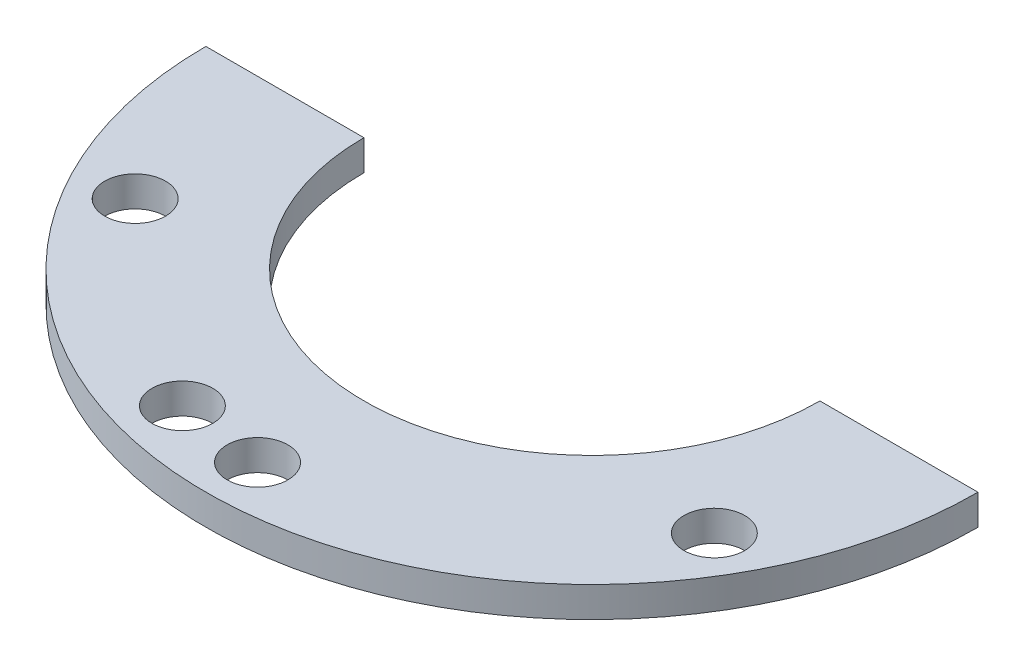
ISO-10303-21;
HEADER;
FILE_DESCRIPTION(('STEP AP214'),'2;1');
FILE_NAME('part.step','',(''),(''),'','','');
FILE_SCHEMA(('AUTOMOTIVE_DESIGN { 1 0 10303 214 1 1 1 1 }'));
ENDSEC;
DATA;
#1=APPLICATION_CONTEXT('core data for automotive mechanical design processes');
#2=APPLICATION_PROTOCOL_DEFINITION('international standard','automotive_design',2000,#1);
#3=PRODUCT_CONTEXT('',#1,'mechanical');
#4=PRODUCT('Part','Part','',(#3));
#5=PRODUCT_RELATED_PRODUCT_CATEGORY('part','',(#4));
#6=PRODUCT_DEFINITION_FORMATION('','',#4);
#7=PRODUCT_DEFINITION_CONTEXT('part definition',#1,'design');
#8=PRODUCT_DEFINITION('design','',#6,#7);
#9=PRODUCT_DEFINITION_SHAPE('','',#8);
#10=(LENGTH_UNIT() NAMED_UNIT(*) SI_UNIT(.MILLI.,.METRE.));
#11=(NAMED_UNIT(*) PLANE_ANGLE_UNIT() SI_UNIT($,.RADIAN.));
#12=(NAMED_UNIT(*) SI_UNIT($,.STERADIAN.) SOLID_ANGLE_UNIT());
#13=UNCERTAINTY_MEASURE_WITH_UNIT(LENGTH_MEASURE(1.E-05),#10,'distance_accuracy_value','');
#14=(GEOMETRIC_REPRESENTATION_CONTEXT(3) GLOBAL_UNCERTAINTY_ASSIGNED_CONTEXT((#13)) GLOBAL_UNIT_ASSIGNED_CONTEXT((#10,
#11,#12)) REPRESENTATION_CONTEXT('',''));
#15=CARTESIAN_POINT('',(0.,0.,0.));
#16=DIRECTION('',(0.,0.,1.));
#17=DIRECTION('',(1.,0.,0.));
#18=AXIS2_PLACEMENT_3D('',#15,#16,#17);
#19=CARTESIAN_POINT('',(0.,1.,0.));
#20=DIRECTION('',(0.,-1.,0.));
#21=DIRECTION('',(0.,0.,-1.));
#22=AXIS2_PLACEMENT_3D('',#19,#20,#21);
#23=CYLINDRICAL_SURFACE('',#22,12.7);
#24=CARTESIAN_POINT('',(0.,1.,0.));
#25=DIRECTION('',(0.,1.,0.));
#26=DIRECTION('',(0.,0.,1.));
#27=AXIS2_PLACEMENT_3D('',#24,#25,#26);
#28=CIRCLE('',#27,12.7);
#29=CARTESIAN_POINT('',(-12.7,1.,0.));
#30=VERTEX_POINT('',#29);
#31=CARTESIAN_POINT('',(12.7,1.,0.));
#32=VERTEX_POINT('',#31);
#33=EDGE_CURVE('E76',#30,#32,#28,.T.);
#34=ORIENTED_EDGE('',*,*,#33,.F.);
#35=DIRECTION('',(0.,-1.,0.));
#36=VECTOR('',#35,1.);
#37=CARTESIAN_POINT('',(-12.7,1.,0.));
#38=LINE('',#37,#36);
#39=CARTESIAN_POINT('',(-12.7,0.,0.));
#40=VERTEX_POINT('',#39);
#41=EDGE_CURVE('E119',#30,#40,#38,.T.);
#42=ORIENTED_EDGE('',*,*,#41,.T.);
#43=CARTESIAN_POINT('',(0.,0.,0.));
#44=DIRECTION('',(0.,1.,0.));
#45=DIRECTION('',(0.,0.,1.));
#46=AXIS2_PLACEMENT_3D('',#43,#44,#45);
#47=CIRCLE('',#46,12.7);
#48=CARTESIAN_POINT('',(12.7,0.,0.));
#49=VERTEX_POINT('',#48);
#50=EDGE_CURVE('E84',#40,#49,#47,.T.);
#51=ORIENTED_EDGE('',*,*,#50,.T.);
#52=DIRECTION('',(0.,-1.,0.));
#53=VECTOR('',#52,1.);
#54=CARTESIAN_POINT('',(12.7,1.,0.));
#55=LINE('',#54,#53);
#56=EDGE_CURVE('E89',#49,#32,#55,.F.);
#57=ORIENTED_EDGE('',*,*,#56,.T.);
#58=EDGE_LOOP('',(#34,#42,#51,#57));
#59=FACE_BOUND('',#58,.T.);
#60=ADVANCED_FACE('F32',(#59),#23,.T.);
#61=CARTESIAN_POINT('',(0.,1.,0.));
#62=DIRECTION('',(0.,1.,0.));
#63=DIRECTION('',(0.,0.,1.));
#64=AXIS2_PLACEMENT_3D('',#61,#62,#63);
#65=PLANE('',#64);
#66=CARTESIAN_POINT('',(-2.84700949612715,1.,10.6251840891799));
#67=DIRECTION('',(0.,1.,0.));
#68=DIRECTION('',(0.,0.,1.));
#69=AXIS2_PLACEMENT_3D('',#66,#67,#68);
#70=CIRCLE('',#69,1.00000000000027);
#71=CARTESIAN_POINT('',(-2.84700949612715,1.,11.6251840891802));
#72=VERTEX_POINT('',#71);
#73=EDGE_CURVE('E85',#72,#72,#70,.T.);
#74=ORIENTED_EDGE('',*,*,#73,.F.);
#75=EDGE_LOOP('',(#74));
#76=FACE_BOUND('',#75,.T.);
#77=DIRECTION('',(1.,0.,0.));
#78=VECTOR('',#77,1.);
#79=CARTESIAN_POINT('',(0.,1.,0.));
#80=LINE('',#79,#78);
#81=CARTESIAN_POINT('',(-7.5,1.,0.));
#82=VERTEX_POINT('',#81);
#83=EDGE_CURVE('E53',#30,#82,#80,.T.);
#84=ORIENTED_EDGE('',*,*,#83,.F.);
#85=ORIENTED_EDGE('',*,*,#33,.T.);
#86=CARTESIAN_POINT('',(7.5,1.,0.));
#87=VERTEX_POINT('',#86);
#88=EDGE_CURVE('E94',#87,#32,#80,.T.);
#89=ORIENTED_EDGE('',*,*,#88,.F.);
#90=CARTESIAN_POINT('',(0.,1.,0.));
#91=DIRECTION('',(0.,1.,0.));
#92=DIRECTION('',(0.,0.,1.));
#93=AXIS2_PLACEMENT_3D('',#90,#91,#92);
#94=CIRCLE('',#93,7.5);
#95=EDGE_CURVE('E88',#82,#87,#94,.T.);
#96=ORIENTED_EDGE('',*,*,#95,.F.);
#97=EDGE_LOOP('',(#84,#85,#89,#96));
#98=FACE_BOUND('',#97,.T.);
#99=CARTESIAN_POINT('',(-9.52627944162812,1.,5.50000000000041));
#100=DIRECTION('',(0.,1.,0.));
#101=DIRECTION('',(0.,0.,1.));
#102=AXIS2_PLACEMENT_3D('',#99,#100,#101);
#103=CIRCLE('',#102,0.999999999999829);
#104=CARTESIAN_POINT('',(-9.52627944162812,1.,6.50000000000024));
#105=VERTEX_POINT('',#104);
#106=EDGE_CURVE('E112',#105,#105,#103,.T.);
#107=ORIENTED_EDGE('',*,*,#106,.F.);
#108=EDGE_LOOP('',(#107));
#109=FACE_BOUND('',#108,.T.);
#110=CARTESIAN_POINT('',(9.35222188245208E-13,1.,11.));
#111=DIRECTION('',(0.,1.,0.));
#112=DIRECTION('',(0.,0.,1.));
#113=AXIS2_PLACEMENT_3D('',#110,#111,#112);
#114=CIRCLE('',#113,0.999999999999467);
#115=CARTESIAN_POINT('',(9.35222188245208E-13,1.,11.9999999999995));
#116=VERTEX_POINT('',#115);
#117=EDGE_CURVE('E109',#116,#116,#114,.T.);
#118=ORIENTED_EDGE('',*,*,#117,.F.);
#119=EDGE_LOOP('',(#118));
#120=FACE_BOUND('',#119,.T.);
#121=CARTESIAN_POINT('',(9.52627944162938,1.,5.49999999999958));
#122=DIRECTION('',(0.,1.,0.));
#123=DIRECTION('',(0.,0.,1.));
#124=AXIS2_PLACEMENT_3D('',#121,#122,#123);
#125=CIRCLE('',#124,0.999999999999871);
#126=CARTESIAN_POINT('',(9.52627944162938,1.,6.49999999999945));
#127=VERTEX_POINT('',#126);
#128=EDGE_CURVE('E104',#127,#127,#125,.T.);
#129=ORIENTED_EDGE('',*,*,#128,.F.);
#130=EDGE_LOOP('',(#129));
#131=FACE_BOUND('',#130,.T.);
#132=ADVANCED_FACE('F139',(#76,#98,#109,#120,#131),#65,.T.);
#133=CARTESIAN_POINT('',(0.,0.,0.));
#134=DIRECTION('',(0.,1.,0.));
#135=DIRECTION('',(0.,0.,1.));
#136=AXIS2_PLACEMENT_3D('',#133,#134,#135);
#137=PLANE('',#136);
#138=CARTESIAN_POINT('',(-2.84700949612715,0.,10.6251840891799));
#139=DIRECTION('',(0.,1.,0.));
#140=DIRECTION('',(0.,0.,1.));
#141=AXIS2_PLACEMENT_3D('',#138,#139,#140);
#142=CIRCLE('',#141,1.00000000000027);
#143=CARTESIAN_POINT('',(-2.84700949612715,0.,11.6251840891802));
#144=VERTEX_POINT('',#143);
#145=EDGE_CURVE('E124',#144,#144,#142,.T.);
#146=ORIENTED_EDGE('',*,*,#145,.T.);
#147=EDGE_LOOP('',(#146));
#148=FACE_BOUND('',#147,.T.);
#149=ORIENTED_EDGE('',*,*,#50,.F.);
#150=DIRECTION('',(1.,0.,0.));
#151=VECTOR('',#150,1.);
#152=CARTESIAN_POINT('',(0.,0.,0.));
#153=LINE('',#152,#151);
#154=CARTESIAN_POINT('',(-7.5,0.,0.));
#155=VERTEX_POINT('',#154);
#156=EDGE_CURVE('E70',#40,#155,#153,.T.);
#157=ORIENTED_EDGE('',*,*,#156,.T.);
#158=CARTESIAN_POINT('',(0.,0.,0.));
#159=DIRECTION('',(0.,1.,0.));
#160=DIRECTION('',(0.,0.,1.));
#161=AXIS2_PLACEMENT_3D('',#158,#159,#160);
#162=CIRCLE('',#161,7.5);
#163=CARTESIAN_POINT('',(7.5,0.,0.));
#164=VERTEX_POINT('',#163);
#165=EDGE_CURVE('E82',#155,#164,#162,.T.);
#166=ORIENTED_EDGE('',*,*,#165,.T.);
#167=EDGE_CURVE('E46',#164,#49,#153,.T.);
#168=ORIENTED_EDGE('',*,*,#167,.T.);
#169=EDGE_LOOP('',(#149,#157,#166,#168));
#170=FACE_BOUND('',#169,.T.);
#171=CARTESIAN_POINT('',(-9.52627944162812,0.,5.50000000000041));
#172=DIRECTION('',(0.,1.,0.));
#173=DIRECTION('',(0.,0.,1.));
#174=AXIS2_PLACEMENT_3D('',#171,#172,#173);
#175=CIRCLE('',#174,0.999999999999829);
#176=CARTESIAN_POINT('',(-9.52627944162812,0.,6.50000000000024));
#177=VERTEX_POINT('',#176);
#178=EDGE_CURVE('E91',#177,#177,#175,.T.);
#179=ORIENTED_EDGE('',*,*,#178,.T.);
#180=EDGE_LOOP('',(#179));
#181=FACE_BOUND('',#180,.T.);
#182=CARTESIAN_POINT('',(9.35222188245208E-13,0.,11.));
#183=DIRECTION('',(0.,1.,0.));
#184=DIRECTION('',(0.,0.,1.));
#185=AXIS2_PLACEMENT_3D('',#182,#183,#184);
#186=CIRCLE('',#185,0.999999999999467);
#187=CARTESIAN_POINT('',(9.35222188245208E-13,0.,11.9999999999995));
#188=VERTEX_POINT('',#187);
#189=EDGE_CURVE('E100',#188,#188,#186,.T.);
#190=ORIENTED_EDGE('',*,*,#189,.T.);
#191=EDGE_LOOP('',(#190));
#192=FACE_BOUND('',#191,.T.);
#193=CARTESIAN_POINT('',(9.52627944162938,0.,5.49999999999958));
#194=DIRECTION('',(0.,1.,0.));
#195=DIRECTION('',(0.,0.,1.));
#196=AXIS2_PLACEMENT_3D('',#193,#194,#195);
#197=CIRCLE('',#196,0.999999999999871);
#198=CARTESIAN_POINT('',(9.52627944162938,0.,6.49999999999945));
#199=VERTEX_POINT('',#198);
#200=EDGE_CURVE('E101',#199,#199,#197,.T.);
#201=ORIENTED_EDGE('',*,*,#200,.T.);
#202=EDGE_LOOP('',(#201));
#203=FACE_BOUND('',#202,.T.);
#204=ADVANCED_FACE('F80',(#148,#170,#181,#192,#203),#137,.F.);
#205=CARTESIAN_POINT('',(9.52627944162938,0.,5.49999999999958));
#206=DIRECTION('',(0.,1.,0.));
#207=DIRECTION('',(0.,0.,1.));
#208=AXIS2_PLACEMENT_3D('',#205,#206,#207);
#209=CYLINDRICAL_SURFACE('',#208,0.999999999999871);
#210=ORIENTED_EDGE('',*,*,#128,.T.);
#211=EDGE_LOOP('',(#210));
#212=FACE_BOUND('',#211,.T.);
#213=ORIENTED_EDGE('',*,*,#200,.F.);
#214=EDGE_LOOP('',(#213));
#215=FACE_BOUND('',#214,.T.);
#216=ADVANCED_FACE('F148',(#212,#215),#209,.F.);
#217=CARTESIAN_POINT('',(9.35222188245208E-13,0.,11.));
#218=DIRECTION('',(0.,1.,0.));
#219=DIRECTION('',(0.,0.,1.));
#220=AXIS2_PLACEMENT_3D('',#217,#218,#219);
#221=CYLINDRICAL_SURFACE('',#220,0.999999999999467);
#222=ORIENTED_EDGE('',*,*,#117,.T.);
#223=EDGE_LOOP('',(#222));
#224=FACE_BOUND('',#223,.T.);
#225=ORIENTED_EDGE('',*,*,#189,.F.);
#226=EDGE_LOOP('',(#225));
#227=FACE_BOUND('',#226,.T.);
#228=ADVANCED_FACE('F152',(#224,#227),#221,.F.);
#229=CARTESIAN_POINT('',(-9.52627944162812,0.,5.50000000000041));
#230=DIRECTION('',(0.,1.,0.));
#231=DIRECTION('',(0.,0.,1.));
#232=AXIS2_PLACEMENT_3D('',#229,#230,#231);
#233=CYLINDRICAL_SURFACE('',#232,0.999999999999829);
#234=ORIENTED_EDGE('',*,*,#106,.T.);
#235=EDGE_LOOP('',(#234));
#236=FACE_BOUND('',#235,.T.);
#237=ORIENTED_EDGE('',*,*,#178,.F.);
#238=EDGE_LOOP('',(#237));
#239=FACE_BOUND('',#238,.T.);
#240=ADVANCED_FACE('F155',(#236,#239),#233,.F.);
#241=CARTESIAN_POINT('',(0.,0.,0.));
#242=DIRECTION('',(0.,1.,0.));
#243=DIRECTION('',(0.,0.,1.));
#244=AXIS2_PLACEMENT_3D('',#241,#242,#243);
#245=CYLINDRICAL_SURFACE('',#244,7.5);
#246=ORIENTED_EDGE('',*,*,#95,.T.);
#247=DIRECTION('',(0.,1.,0.));
#248=VECTOR('',#247,1.);
#249=CARTESIAN_POINT('',(7.5,0.,0.));
#250=LINE('',#249,#248);
#251=EDGE_CURVE('E11',#87,#164,#250,.F.);
#252=ORIENTED_EDGE('',*,*,#251,.T.);
#253=ORIENTED_EDGE('',*,*,#165,.F.);
#254=DIRECTION('',(0.,1.,0.));
#255=VECTOR('',#254,1.);
#256=CARTESIAN_POINT('',(-7.5,0.,0.));
#257=LINE('',#256,#255);
#258=EDGE_CURVE('E39',#155,#82,#257,.T.);
#259=ORIENTED_EDGE('',*,*,#258,.T.);
#260=EDGE_LOOP('',(#246,#252,#253,#259));
#261=FACE_BOUND('',#260,.T.);
#262=ADVANCED_FACE('F87',(#261),#245,.F.);
#263=CARTESIAN_POINT('',(0.,0.,0.));
#264=DIRECTION('',(0.,0.,1.));
#265=DIRECTION('',(1.,0.,0.));
#266=AXIS2_PLACEMENT_3D('',#263,#264,#265);
#267=PLANE('',#266);
#268=ORIENTED_EDGE('',*,*,#83,.T.);
#269=ORIENTED_EDGE('',*,*,#258,.F.);
#270=ORIENTED_EDGE('',*,*,#156,.F.);
#271=ORIENTED_EDGE('',*,*,#41,.F.);
#272=EDGE_LOOP('',(#268,#269,#270,#271));
#273=FACE_BOUND('',#272,.T.);
#274=ADVANCED_FACE('F69',(#273),#267,.F.);
#275=ORIENTED_EDGE('',*,*,#167,.F.);
#276=ORIENTED_EDGE('',*,*,#251,.F.);
#277=ORIENTED_EDGE('',*,*,#88,.T.);
#278=ORIENTED_EDGE('',*,*,#56,.F.);
#279=EDGE_LOOP('',(#275,#276,#277,#278));
#280=FACE_BOUND('',#279,.T.);
#281=ADVANCED_FACE('F131',(#280),#267,.F.);
#282=CARTESIAN_POINT('',(-2.84700949612715,0.,10.6251840891799));
#283=DIRECTION('',(0.,1.,0.));
#284=DIRECTION('',(0.,0.,1.));
#285=AXIS2_PLACEMENT_3D('',#282,#283,#284);
#286=CYLINDRICAL_SURFACE('',#285,1.00000000000027);
#287=ORIENTED_EDGE('',*,*,#73,.T.);
#288=EDGE_LOOP('',(#287));
#289=FACE_BOUND('',#288,.T.);
#290=ORIENTED_EDGE('',*,*,#145,.F.);
#291=EDGE_LOOP('',(#290));
#292=FACE_BOUND('',#291,.T.);
#293=ADVANCED_FACE('F129',(#289,#292),#286,.F.);
#294=CLOSED_SHELL('',(#60,#132,#204,#216,#228,#240,#262,#274,#281,#293));
#295=MANIFOLD_SOLID_BREP('B2',#294);
#296=ADVANCED_BREP_SHAPE_REPRESENTATION('',(#18,#295),#14);
#297=SHAPE_DEFINITION_REPRESENTATION(#9,#296);
ENDSEC;
END-ISO-10303-21;
